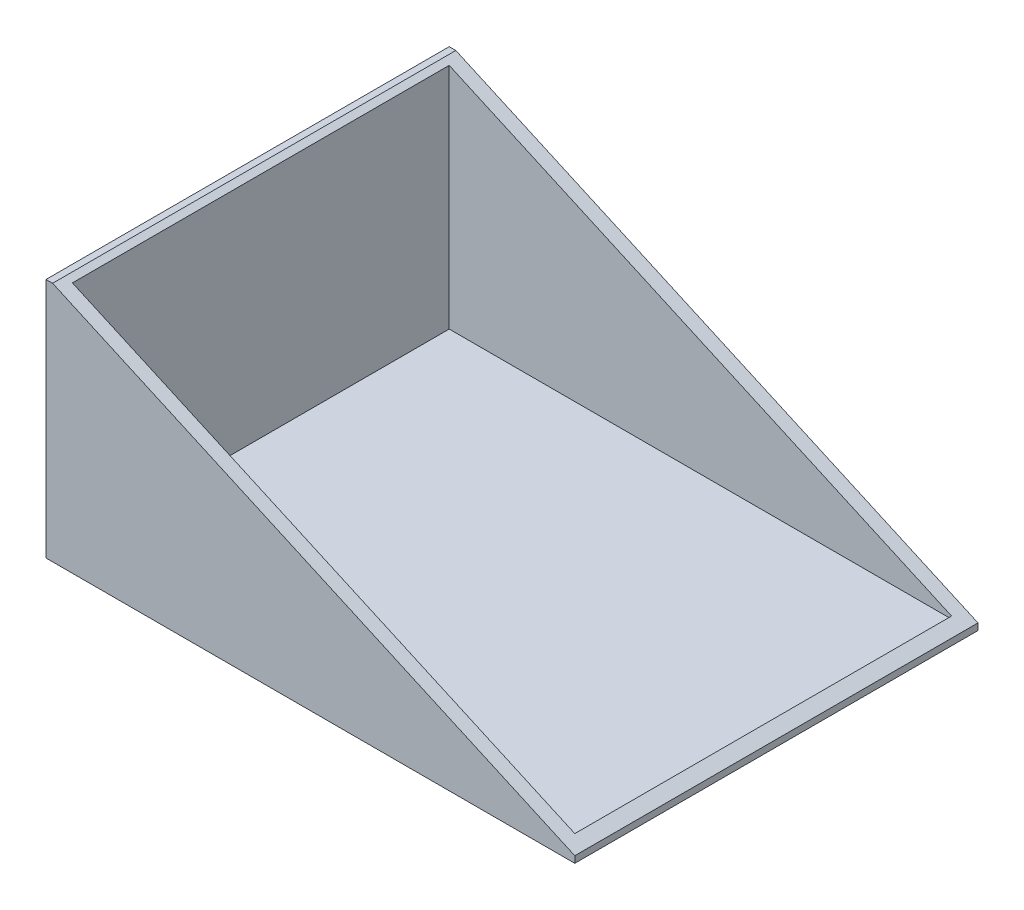
ISO-10303-21;
HEADER;
FILE_DESCRIPTION(('STEP AP214'),'2;1');
FILE_NAME('part.step','',(''),(''),'','','');
FILE_SCHEMA(('AUTOMOTIVE_DESIGN { 1 0 10303 214 1 1 1 1 }'));
ENDSEC;
DATA;
#1=APPLICATION_CONTEXT('core data for automotive mechanical design processes');
#2=APPLICATION_PROTOCOL_DEFINITION('international standard','automotive_design',2000,#1);
#3=PRODUCT_CONTEXT('',#1,'mechanical');
#4=PRODUCT('Part','Part','',(#3));
#5=PRODUCT_RELATED_PRODUCT_CATEGORY('part','',(#4));
#6=PRODUCT_DEFINITION_FORMATION('','',#4);
#7=PRODUCT_DEFINITION_CONTEXT('part definition',#1,'design');
#8=PRODUCT_DEFINITION('design','',#6,#7);
#9=PRODUCT_DEFINITION_SHAPE('','',#8);
#10=(LENGTH_UNIT() NAMED_UNIT(*) SI_UNIT(.MILLI.,.METRE.));
#11=(NAMED_UNIT(*) PLANE_ANGLE_UNIT() SI_UNIT($,.RADIAN.));
#12=(NAMED_UNIT(*) SI_UNIT($,.STERADIAN.) SOLID_ANGLE_UNIT());
#13=UNCERTAINTY_MEASURE_WITH_UNIT(LENGTH_MEASURE(1.E-05),#10,'distance_accuracy_value','');
#14=(GEOMETRIC_REPRESENTATION_CONTEXT(3) GLOBAL_UNCERTAINTY_ASSIGNED_CONTEXT((#13)) GLOBAL_UNIT_ASSIGNED_CONTEXT((#10,
#11,#12)) REPRESENTATION_CONTEXT('',''));
#15=CARTESIAN_POINT('',(0.,0.,0.));
#16=DIRECTION('',(0.,0.,1.));
#17=DIRECTION('',(1.,0.,0.));
#18=AXIS2_PLACEMENT_3D('',#15,#16,#17);
#19=CARTESIAN_POINT('',(0.,1.5,0.));
#20=DIRECTION('',(1.,0.,0.));
#21=DIRECTION('',(0.,0.,-1.));
#22=AXIS2_PLACEMENT_3D('',#19,#20,#21);
#23=PLANE('',#22);
#24=DIRECTION('',(0.,0.,1.));
#25=VECTOR('',#24,1.);
#26=CARTESIAN_POINT('',(0.,0.,0.));
#27=LINE('',#26,#25);
#28=CARTESIAN_POINT('',(0.,0.,-61.));
#29=VERTEX_POINT('',#28);
#30=CARTESIAN_POINT('',(0.,0.,0.));
#31=VERTEX_POINT('',#30);
#32=EDGE_CURVE('E144',#29,#31,#27,.T.);
#33=ORIENTED_EDGE('',*,*,#32,.T.);
#34=DIRECTION('',(0.,-1.,0.));
#35=VECTOR('',#34,1.);
#36=CARTESIAN_POINT('',(0.,1.5,0.));
#37=LINE('',#36,#35);
#38=CARTESIAN_POINT('',(0.,36.5,0.));
#39=VERTEX_POINT('',#38);
#40=EDGE_CURVE('E42',#39,#31,#37,.T.);
#41=ORIENTED_EDGE('',*,*,#40,.F.);
#42=DIRECTION('',(0.,0.,1.));
#43=VECTOR('',#42,1.);
#44=CARTESIAN_POINT('',(0.,36.5,-61.));
#45=LINE('',#44,#43);
#46=CARTESIAN_POINT('',(0.,36.5,-61.));
#47=VERTEX_POINT('',#46);
#48=EDGE_CURVE('E265',#47,#39,#45,.T.);
#49=ORIENTED_EDGE('',*,*,#48,.F.);
#50=DIRECTION('',(0.,-1.,0.));
#51=VECTOR('',#50,1.);
#52=CARTESIAN_POINT('',(0.,1.5,-61.));
#53=LINE('',#52,#51);
#54=EDGE_CURVE('E124',#47,#29,#53,.T.);
#55=ORIENTED_EDGE('',*,*,#54,.T.);
#56=EDGE_LOOP('',(#33,#41,#49,#55));
#57=FACE_BOUND('',#56,.T.);
#58=ADVANCED_FACE('F35',(#57),#23,.F.);
#59=CARTESIAN_POINT('',(0.,1.5,0.));
#60=DIRECTION('',(0.,0.,-1.));
#61=DIRECTION('',(-1.,0.,0.));
#62=AXIS2_PLACEMENT_3D('',#59,#60,#61);
#63=PLANE('',#62);
#64=DIRECTION('',(0.,-1.,0.));
#65=VECTOR('',#64,1.);
#66=CARTESIAN_POINT('',(80.,1.5,0.));
#67=LINE('',#66,#65);
#68=CARTESIAN_POINT('',(80.,1.,0.));
#69=VERTEX_POINT('',#68);
#70=CARTESIAN_POINT('',(80.,0.,0.));
#71=VERTEX_POINT('',#70);
#72=EDGE_CURVE('E123',#69,#71,#67,.T.);
#73=ORIENTED_EDGE('',*,*,#72,.F.);
#74=DIRECTION('',(0.912137417035069,-0.409884535503101,0.));
#75=VECTOR('',#74,1.);
#76=CARTESIAN_POINT('',(80.,1.,0.));
#77=LINE('',#76,#75);
#78=CARTESIAN_POINT('',(1.00000000000003,36.5,0.));
#79=VERTEX_POINT('',#78);
#80=EDGE_CURVE('E105',#79,#69,#77,.T.);
#81=ORIENTED_EDGE('',*,*,#80,.F.);
#82=DIRECTION('',(1.,0.,0.));
#83=VECTOR('',#82,1.);
#84=CARTESIAN_POINT('',(0.,36.5,0.));
#85=LINE('',#84,#83);
#86=EDGE_CURVE('E139',#39,#79,#85,.T.);
#87=ORIENTED_EDGE('',*,*,#86,.F.);
#88=ORIENTED_EDGE('',*,*,#40,.T.);
#89=DIRECTION('',(1.,0.,0.));
#90=VECTOR('',#89,1.);
#91=CARTESIAN_POINT('',(0.,0.,0.));
#92=LINE('',#91,#90);
#93=EDGE_CURVE('E137',#31,#71,#92,.T.);
#94=ORIENTED_EDGE('',*,*,#93,.T.);
#95=EDGE_LOOP('',(#73,#81,#87,#88,#94));
#96=FACE_BOUND('',#95,.T.);
#97=ADVANCED_FACE('F136',(#96),#63,.F.);
#98=CARTESIAN_POINT('',(80.,1.5,0.));
#99=DIRECTION('',(-1.,0.,0.));
#100=DIRECTION('',(0.,0.,1.));
#101=AXIS2_PLACEMENT_3D('',#98,#99,#100);
#102=PLANE('',#101);
#103=DIRECTION('',(0.,-1.,0.));
#104=VECTOR('',#103,1.);
#105=CARTESIAN_POINT('',(80.,1.5,-61.));
#106=LINE('',#105,#104);
#107=CARTESIAN_POINT('',(80.,1.,-61.));
#108=VERTEX_POINT('',#107);
#109=CARTESIAN_POINT('',(80.,0.,-61.));
#110=VERTEX_POINT('',#109);
#111=EDGE_CURVE('E114',#108,#110,#106,.T.);
#112=ORIENTED_EDGE('',*,*,#111,.F.);
#113=DIRECTION('',(0.,0.,1.));
#114=VECTOR('',#113,1.);
#115=CARTESIAN_POINT('',(80.,1.,-61.));
#116=LINE('',#115,#114);
#117=EDGE_CURVE('E102',#108,#69,#116,.T.);
#118=ORIENTED_EDGE('',*,*,#117,.T.);
#119=ORIENTED_EDGE('',*,*,#72,.T.);
#120=DIRECTION('',(0.,0.,-1.));
#121=VECTOR('',#120,1.);
#122=CARTESIAN_POINT('',(80.,0.,0.));
#123=LINE('',#122,#121);
#124=EDGE_CURVE('E121',#71,#110,#123,.T.);
#125=ORIENTED_EDGE('',*,*,#124,.T.);
#126=EDGE_LOOP('',(#112,#118,#119,#125));
#127=FACE_BOUND('',#126,.T.);
#128=ADVANCED_FACE('F119',(#127),#102,.F.);
#129=CARTESIAN_POINT('',(0.,1.5,-61.));
#130=DIRECTION('',(0.,0.,1.));
#131=DIRECTION('',(1.,0.,0.));
#132=AXIS2_PLACEMENT_3D('',#129,#130,#131);
#133=PLANE('',#132);
#134=DIRECTION('',(-1.,0.,0.));
#135=VECTOR('',#134,1.);
#136=CARTESIAN_POINT('',(0.,36.5,-61.));
#137=LINE('',#136,#135);
#138=CARTESIAN_POINT('',(1.00000000000003,36.5,-61.));
#139=VERTEX_POINT('',#138);
#140=EDGE_CURVE('E117',#139,#47,#137,.T.);
#141=ORIENTED_EDGE('',*,*,#140,.F.);
#142=DIRECTION('',(0.912137417035069,-0.409884535503101,0.));
#143=VECTOR('',#142,1.);
#144=CARTESIAN_POINT('',(80.,1.,-61.));
#145=LINE('',#144,#143);
#146=EDGE_CURVE('E49',#139,#108,#145,.T.);
#147=ORIENTED_EDGE('',*,*,#146,.T.);
#148=ORIENTED_EDGE('',*,*,#111,.T.);
#149=DIRECTION('',(-1.,0.,0.));
#150=VECTOR('',#149,1.);
#151=CARTESIAN_POINT('',(0.,0.,-61.));
#152=LINE('',#151,#150);
#153=EDGE_CURVE('E128',#110,#29,#152,.T.);
#154=ORIENTED_EDGE('',*,*,#153,.T.);
#155=ORIENTED_EDGE('',*,*,#54,.F.);
#156=EDGE_LOOP('',(#141,#147,#148,#154,#155));
#157=FACE_BOUND('',#156,.T.);
#158=ADVANCED_FACE('F113',(#157),#133,.F.);
#159=CARTESIAN_POINT('',(0.,0.,0.));
#160=DIRECTION('',(0.,-1.,0.));
#161=DIRECTION('',(0.,0.,-1.));
#162=AXIS2_PLACEMENT_3D('',#159,#160,#161);
#163=PLANE('',#162);
#164=ORIENTED_EDGE('',*,*,#32,.F.);
#165=ORIENTED_EDGE('',*,*,#153,.F.);
#166=ORIENTED_EDGE('',*,*,#124,.F.);
#167=ORIENTED_EDGE('',*,*,#93,.F.);
#168=EDGE_LOOP('',(#164,#165,#166,#167));
#169=FACE_BOUND('',#168,.T.);
#170=ADVANCED_FACE('F151',(#169),#163,.T.);
#171=CARTESIAN_POINT('',(0.,36.5,0.));
#172=DIRECTION('',(0.,1.,0.));
#173=DIRECTION('',(0.,0.,1.));
#174=AXIS2_PLACEMENT_3D('',#171,#172,#173);
#175=PLANE('',#174);
#176=DIRECTION('',(0.,0.,1.));
#177=VECTOR('',#176,1.);
#178=CARTESIAN_POINT('',(1.00000000000003,36.5,-61.));
#179=LINE('',#178,#177);
#180=EDGE_CURVE('E109',#139,#79,#179,.T.);
#181=ORIENTED_EDGE('',*,*,#180,.F.);
#182=ORIENTED_EDGE('',*,*,#140,.T.);
#183=ORIENTED_EDGE('',*,*,#48,.T.);
#184=ORIENTED_EDGE('',*,*,#86,.T.);
#185=EDGE_LOOP('',(#181,#182,#183,#184));
#186=FACE_BOUND('',#185,.T.);
#187=ADVANCED_FACE('F153',(#186),#175,.T.);
#188=CARTESIAN_POINT('',(80.,1.,-61.));
#189=DIRECTION('',(-0.409884535503101,-0.912137417035069,0.));
#190=DIRECTION('',(0.912137417035069,-0.409884535503101,0.));
#191=AXIS2_PLACEMENT_3D('',#188,#189,#190);
#192=PLANE('',#191);
#193=DIRECTION('',(0.912137417035069,-0.409884535503101,0.));
#194=VECTOR('',#193,1.);
#195=CARTESIAN_POINT('',(1.83199466755541,36.1261289785036,-59.));
#196=LINE('',#195,#194);
#197=CARTESIAN_POINT('',(2.,36.0506329113924,-59.));
#198=VERTEX_POINT('',#197);
#199=CARTESIAN_POINT('',(78.,1.8987341772152,-59.));
#200=VERTEX_POINT('',#199);
#201=EDGE_CURVE('E56',#198,#200,#196,.T.);
#202=ORIENTED_EDGE('',*,*,#201,.T.);
#203=DIRECTION('',(0.,0.,1.));
#204=VECTOR('',#203,1.);
#205=CARTESIAN_POINT('',(78.,1.8987341772152,-59.));
#206=LINE('',#205,#204);
#207=CARTESIAN_POINT('',(78.,1.89873417721519,-2.));
#208=VERTEX_POINT('',#207);
#209=EDGE_CURVE('E11',#200,#208,#206,.T.);
#210=ORIENTED_EDGE('',*,*,#209,.T.);
#211=DIRECTION('',(-0.912137417035069,0.409884535503101,0.));
#212=VECTOR('',#211,1.);
#213=CARTESIAN_POINT('',(1.83199466755542,36.1261289785036,-2.));
#214=LINE('',#213,#212);
#215=CARTESIAN_POINT('',(2.00000000000001,36.0506329113924,-2.));
#216=VERTEX_POINT('',#215);
#217=EDGE_CURVE('E266',#208,#216,#214,.T.);
#218=ORIENTED_EDGE('',*,*,#217,.T.);
#219=DIRECTION('',(0.,0.,-1.));
#220=VECTOR('',#219,1.);
#221=CARTESIAN_POINT('',(2.,36.0506329113924,-59.));
#222=LINE('',#221,#220);
#223=EDGE_CURVE('E268',#216,#198,#222,.T.);
#224=ORIENTED_EDGE('',*,*,#223,.T.);
#225=EDGE_LOOP('',(#202,#210,#218,#224));
#226=FACE_BOUND('',#225,.T.);
#227=ORIENTED_EDGE('',*,*,#80,.T.);
#228=ORIENTED_EDGE('',*,*,#117,.F.);
#229=ORIENTED_EDGE('',*,*,#146,.F.);
#230=ORIENTED_EDGE('',*,*,#180,.T.);
#231=EDGE_LOOP('',(#227,#228,#229,#230));
#232=FACE_BOUND('',#231,.T.);
#233=ADVANCED_FACE('F103',(#226,#232),#192,.F.);
#234=CARTESIAN_POINT('',(0.,1.5,0.));
#235=DIRECTION('',(0.,-1.,0.));
#236=DIRECTION('',(0.,0.,-1.));
#237=AXIS2_PLACEMENT_3D('',#234,#235,#236);
#238=PLANE('',#237);
#239=DIRECTION('',(0.,0.,-1.));
#240=VECTOR('',#239,1.);
#241=CARTESIAN_POINT('',(78.,1.5,-59.));
#242=LINE('',#241,#240);
#243=CARTESIAN_POINT('',(78.,1.5,-2.));
#244=VERTEX_POINT('',#243);
#245=CARTESIAN_POINT('',(78.,1.5,-59.));
#246=VERTEX_POINT('',#245);
#247=EDGE_CURVE('E245',#244,#246,#242,.T.);
#248=ORIENTED_EDGE('',*,*,#247,.T.);
#249=DIRECTION('',(-1.,0.,0.));
#250=VECTOR('',#249,1.);
#251=CARTESIAN_POINT('',(2.,1.5,-59.));
#252=LINE('',#251,#250);
#253=CARTESIAN_POINT('',(2.,1.5,-59.));
#254=VERTEX_POINT('',#253);
#255=EDGE_CURVE('E248',#246,#254,#252,.T.);
#256=ORIENTED_EDGE('',*,*,#255,.T.);
#257=DIRECTION('',(0.,0.,1.));
#258=VECTOR('',#257,1.);
#259=CARTESIAN_POINT('',(2.,1.5,-59.));
#260=LINE('',#259,#258);
#261=CARTESIAN_POINT('',(2.00000000000001,1.5,-2.));
#262=VERTEX_POINT('',#261);
#263=EDGE_CURVE('E256',#254,#262,#260,.T.);
#264=ORIENTED_EDGE('',*,*,#263,.T.);
#265=DIRECTION('',(1.,0.,0.));
#266=VECTOR('',#265,1.);
#267=CARTESIAN_POINT('',(2.00000000000001,1.5,-2.));
#268=LINE('',#267,#266);
#269=EDGE_CURVE('E250',#262,#244,#268,.T.);
#270=ORIENTED_EDGE('',*,*,#269,.T.);
#271=EDGE_LOOP('',(#248,#256,#264,#270));
#272=FACE_BOUND('',#271,.T.);
#273=ADVANCED_FACE('F194',(#272),#238,.F.);
#274=CARTESIAN_POINT('',(78.,36.5,-59.));
#275=DIRECTION('',(-1.,0.,0.));
#276=DIRECTION('',(0.,0.,1.));
#277=AXIS2_PLACEMENT_3D('',#274,#275,#276);
#278=PLANE('',#277);
#279=ORIENTED_EDGE('',*,*,#209,.F.);
#280=DIRECTION('',(0.,-1.,0.));
#281=VECTOR('',#280,1.);
#282=CARTESIAN_POINT('',(78.,36.5,-59.));
#283=LINE('',#282,#281);
#284=EDGE_CURVE('E252',#200,#246,#283,.T.);
#285=ORIENTED_EDGE('',*,*,#284,.T.);
#286=ORIENTED_EDGE('',*,*,#247,.F.);
#287=DIRECTION('',(0.,-1.,0.));
#288=VECTOR('',#287,1.);
#289=CARTESIAN_POINT('',(78.,36.5,-2.));
#290=LINE('',#289,#288);
#291=EDGE_CURVE('E254',#208,#244,#290,.T.);
#292=ORIENTED_EDGE('',*,*,#291,.F.);
#293=EDGE_LOOP('',(#279,#285,#286,#292));
#294=FACE_BOUND('',#293,.T.);
#295=ADVANCED_FACE('F201',(#294),#278,.T.);
#296=CARTESIAN_POINT('',(2.00000000000001,36.5,-2.));
#297=DIRECTION('',(0.,0.,-1.));
#298=DIRECTION('',(-1.,0.,0.));
#299=AXIS2_PLACEMENT_3D('',#296,#297,#298);
#300=PLANE('',#299);
#301=ORIENTED_EDGE('',*,*,#217,.F.);
#302=ORIENTED_EDGE('',*,*,#291,.T.);
#303=ORIENTED_EDGE('',*,*,#269,.F.);
#304=DIRECTION('',(0.,-1.,0.));
#305=VECTOR('',#304,1.);
#306=CARTESIAN_POINT('',(2.00000000000001,36.5,-2.));
#307=LINE('',#306,#305);
#308=EDGE_CURVE('E261',#216,#262,#307,.T.);
#309=ORIENTED_EDGE('',*,*,#308,.F.);
#310=EDGE_LOOP('',(#301,#302,#303,#309));
#311=FACE_BOUND('',#310,.T.);
#312=ADVANCED_FACE('F205',(#311),#300,.T.);
#313=CARTESIAN_POINT('',(2.,36.5,-59.));
#314=DIRECTION('',(1.,0.,0.));
#315=DIRECTION('',(0.,0.,-1.));
#316=AXIS2_PLACEMENT_3D('',#313,#314,#315);
#317=PLANE('',#316);
#318=ORIENTED_EDGE('',*,*,#223,.F.);
#319=ORIENTED_EDGE('',*,*,#308,.T.);
#320=ORIENTED_EDGE('',*,*,#263,.F.);
#321=DIRECTION('',(0.,-1.,0.));
#322=VECTOR('',#321,1.);
#323=CARTESIAN_POINT('',(2.,36.5,-59.));
#324=LINE('',#323,#322);
#325=EDGE_CURVE('E263',#198,#254,#324,.T.);
#326=ORIENTED_EDGE('',*,*,#325,.F.);
#327=EDGE_LOOP('',(#318,#319,#320,#326));
#328=FACE_BOUND('',#327,.T.);
#329=ADVANCED_FACE('F215',(#328),#317,.T.);
#330=CARTESIAN_POINT('',(2.,36.5,-59.));
#331=DIRECTION('',(0.,0.,1.));
#332=DIRECTION('',(1.,0.,0.));
#333=AXIS2_PLACEMENT_3D('',#330,#331,#332);
#334=PLANE('',#333);
#335=ORIENTED_EDGE('',*,*,#201,.F.);
#336=ORIENTED_EDGE('',*,*,#325,.T.);
#337=ORIENTED_EDGE('',*,*,#255,.F.);
#338=ORIENTED_EDGE('',*,*,#284,.F.);
#339=EDGE_LOOP('',(#335,#336,#337,#338));
#340=FACE_BOUND('',#339,.T.);
#341=ADVANCED_FACE('F225',(#340),#334,.T.);
#342=CLOSED_SHELL('',(#58,#97,#128,#158,#170,#187,#233,#273,#295,#312,#329,#341));
#343=MANIFOLD_SOLID_BREP('B2',#342);
#344=ADVANCED_BREP_SHAPE_REPRESENTATION('',(#18,#343),#14);
#345=SHAPE_DEFINITION_REPRESENTATION(#9,#344);
ENDSEC;
END-ISO-10303-21;
